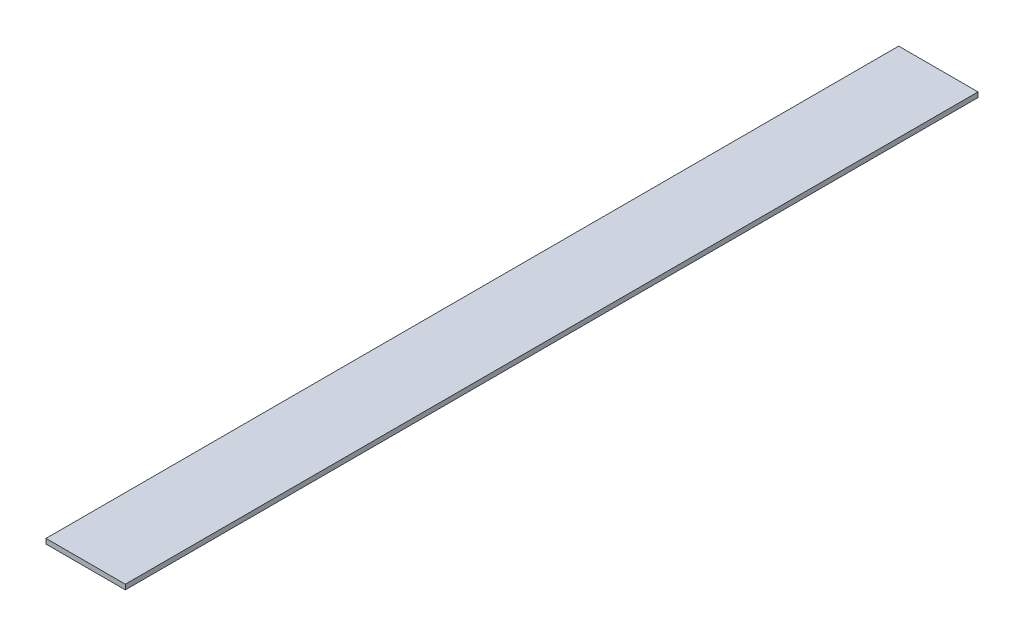
ISO-10303-21;
HEADER;
FILE_DESCRIPTION(('STEP AP214'),'2;1');
FILE_NAME('part.step','',(''),(''),'','','');
FILE_SCHEMA(('AUTOMOTIVE_DESIGN { 1 0 10303 214 1 1 1 1 }'));
ENDSEC;
DATA;
#1=APPLICATION_CONTEXT('core data for automotive mechanical design processes');
#2=APPLICATION_PROTOCOL_DEFINITION('international standard','automotive_design',2000,#1);
#3=PRODUCT_CONTEXT('',#1,'mechanical');
#4=PRODUCT('Part','Part','',(#3));
#5=PRODUCT_RELATED_PRODUCT_CATEGORY('part','',(#4));
#6=PRODUCT_DEFINITION_FORMATION('','',#4);
#7=PRODUCT_DEFINITION_CONTEXT('part definition',#1,'design');
#8=PRODUCT_DEFINITION('design','',#6,#7);
#9=PRODUCT_DEFINITION_SHAPE('','',#8);
#10=(LENGTH_UNIT() NAMED_UNIT(*) SI_UNIT(.MILLI.,.METRE.));
#11=(NAMED_UNIT(*) PLANE_ANGLE_UNIT() SI_UNIT($,.RADIAN.));
#12=(NAMED_UNIT(*) SI_UNIT($,.STERADIAN.) SOLID_ANGLE_UNIT());
#13=UNCERTAINTY_MEASURE_WITH_UNIT(LENGTH_MEASURE(1.E-05),#10,'distance_accuracy_value','');
#14=(GEOMETRIC_REPRESENTATION_CONTEXT(3) GLOBAL_UNCERTAINTY_ASSIGNED_CONTEXT((#13)) GLOBAL_UNIT_ASSIGNED_CONTEXT((#10,
#11,#12)) REPRESENTATION_CONTEXT('',''));
#15=CARTESIAN_POINT('',(0.,0.,0.));
#16=DIRECTION('',(0.,0.,1.));
#17=DIRECTION('',(1.,0.,0.));
#18=AXIS2_PLACEMENT_3D('',#15,#16,#17);
#19=CARTESIAN_POINT('',(0.,3.175,0.));
#20=DIRECTION('',(1.,0.,0.));
#21=DIRECTION('',(0.,0.,-1.));
#22=AXIS2_PLACEMENT_3D('',#19,#20,#21);
#23=PLANE('',#22);
#24=DIRECTION('',(0.,0.,1.));
#25=VECTOR('',#24,1.);
#26=CARTESIAN_POINT('',(0.,0.,0.));
#27=LINE('',#26,#25);
#28=CARTESIAN_POINT('',(0.,0.,-546.1));
#29=VERTEX_POINT('',#28);
#30=CARTESIAN_POINT('',(0.,0.,0.));
#31=VERTEX_POINT('',#30);
#32=EDGE_CURVE('E95',#29,#31,#27,.T.);
#33=ORIENTED_EDGE('',*,*,#32,.T.);
#34=DIRECTION('',(0.,-1.,0.));
#35=VECTOR('',#34,1.);
#36=CARTESIAN_POINT('',(0.,3.175,0.));
#37=LINE('',#36,#35);
#38=CARTESIAN_POINT('',(0.,3.175,0.));
#39=VERTEX_POINT('',#38);
#40=EDGE_CURVE('E11',#39,#31,#37,.T.);
#41=ORIENTED_EDGE('',*,*,#40,.F.);
#42=DIRECTION('',(0.,0.,1.));
#43=VECTOR('',#42,1.);
#44=CARTESIAN_POINT('',(0.,3.175,0.));
#45=LINE('',#44,#43);
#46=CARTESIAN_POINT('',(0.,3.175,-546.1));
#47=VERTEX_POINT('',#46);
#48=EDGE_CURVE('E83',#47,#39,#45,.T.);
#49=ORIENTED_EDGE('',*,*,#48,.F.);
#50=DIRECTION('',(0.,-1.,0.));
#51=VECTOR('',#50,1.);
#52=CARTESIAN_POINT('',(0.,3.175,-546.1));
#53=LINE('',#52,#51);
#54=EDGE_CURVE('E91',#47,#29,#53,.T.);
#55=ORIENTED_EDGE('',*,*,#54,.T.);
#56=EDGE_LOOP('',(#33,#41,#49,#55));
#57=FACE_BOUND('',#56,.T.);
#58=ADVANCED_FACE('F32',(#57),#23,.F.);
#59=CARTESIAN_POINT('',(0.,3.175,0.));
#60=DIRECTION('',(0.,0.,-1.));
#61=DIRECTION('',(-1.,0.,0.));
#62=AXIS2_PLACEMENT_3D('',#59,#60,#61);
#63=PLANE('',#62);
#64=DIRECTION('',(1.,0.,0.));
#65=VECTOR('',#64,1.);
#66=CARTESIAN_POINT('',(0.,0.,0.));
#67=LINE('',#66,#65);
#68=CARTESIAN_POINT('',(50.8,0.,0.));
#69=VERTEX_POINT('',#68);
#70=EDGE_CURVE('E87',#31,#69,#67,.T.);
#71=ORIENTED_EDGE('',*,*,#70,.T.);
#72=DIRECTION('',(0.,-1.,0.));
#73=VECTOR('',#72,1.);
#74=CARTESIAN_POINT('',(50.8,3.175,0.));
#75=LINE('',#74,#73);
#76=CARTESIAN_POINT('',(50.8,3.175,0.));
#77=VERTEX_POINT('',#76);
#78=EDGE_CURVE('E40',#77,#69,#75,.T.);
#79=ORIENTED_EDGE('',*,*,#78,.F.);
#80=DIRECTION('',(1.,0.,0.));
#81=VECTOR('',#80,1.);
#82=CARTESIAN_POINT('',(0.,3.175,0.));
#83=LINE('',#82,#81);
#84=EDGE_CURVE('E78',#39,#77,#83,.T.);
#85=ORIENTED_EDGE('',*,*,#84,.F.);
#86=ORIENTED_EDGE('',*,*,#40,.T.);
#87=EDGE_LOOP('',(#71,#79,#85,#86));
#88=FACE_BOUND('',#87,.T.);
#89=ADVANCED_FACE('F86',(#88),#63,.F.);
#90=CARTESIAN_POINT('',(50.8,3.175,0.));
#91=DIRECTION('',(-1.,0.,0.));
#92=DIRECTION('',(0.,0.,1.));
#93=AXIS2_PLACEMENT_3D('',#90,#91,#92);
#94=PLANE('',#93);
#95=DIRECTION('',(0.,0.,-1.));
#96=VECTOR('',#95,1.);
#97=CARTESIAN_POINT('',(50.8,0.,0.));
#98=LINE('',#97,#96);
#99=CARTESIAN_POINT('',(50.8,0.,-546.1));
#100=VERTEX_POINT('',#99);
#101=EDGE_CURVE('E65',#69,#100,#98,.T.);
#102=ORIENTED_EDGE('',*,*,#101,.T.);
#103=DIRECTION('',(0.,-1.,0.));
#104=VECTOR('',#103,1.);
#105=CARTESIAN_POINT('',(50.8,3.175,-546.1));
#106=LINE('',#105,#104);
#107=CARTESIAN_POINT('',(50.8,3.175,-546.1));
#108=VERTEX_POINT('',#107);
#109=EDGE_CURVE('E88',#108,#100,#106,.T.);
#110=ORIENTED_EDGE('',*,*,#109,.F.);
#111=DIRECTION('',(0.,0.,-1.));
#112=VECTOR('',#111,1.);
#113=CARTESIAN_POINT('',(50.8,3.175,0.));
#114=LINE('',#113,#112);
#115=EDGE_CURVE('E81',#77,#108,#114,.T.);
#116=ORIENTED_EDGE('',*,*,#115,.F.);
#117=ORIENTED_EDGE('',*,*,#78,.T.);
#118=EDGE_LOOP('',(#102,#110,#116,#117));
#119=FACE_BOUND('',#118,.T.);
#120=ADVANCED_FACE('F89',(#119),#94,.F.);
#121=CARTESIAN_POINT('',(0.,3.175,-546.1));
#122=DIRECTION('',(0.,0.,1.));
#123=DIRECTION('',(1.,0.,0.));
#124=AXIS2_PLACEMENT_3D('',#121,#122,#123);
#125=PLANE('',#124);
#126=DIRECTION('',(-1.,0.,0.));
#127=VECTOR('',#126,1.);
#128=CARTESIAN_POINT('',(0.,0.,-546.1));
#129=LINE('',#128,#127);
#130=EDGE_CURVE('E71',#100,#29,#129,.T.);
#131=ORIENTED_EDGE('',*,*,#130,.T.);
#132=ORIENTED_EDGE('',*,*,#54,.F.);
#133=DIRECTION('',(-1.,0.,0.));
#134=VECTOR('',#133,1.);
#135=CARTESIAN_POINT('',(0.,3.175,-546.1));
#136=LINE('',#135,#134);
#137=EDGE_CURVE('E48',#108,#47,#136,.T.);
#138=ORIENTED_EDGE('',*,*,#137,.F.);
#139=ORIENTED_EDGE('',*,*,#109,.T.);
#140=EDGE_LOOP('',(#131,#132,#138,#139));
#141=FACE_BOUND('',#140,.T.);
#142=ADVANCED_FACE('F102',(#141),#125,.F.);
#143=CARTESIAN_POINT('',(0.,3.175,0.));
#144=DIRECTION('',(0.,-1.,0.));
#145=DIRECTION('',(0.,0.,-1.));
#146=AXIS2_PLACEMENT_3D('',#143,#144,#145);
#147=PLANE('',#146);
#148=ORIENTED_EDGE('',*,*,#48,.T.);
#149=ORIENTED_EDGE('',*,*,#84,.T.);
#150=ORIENTED_EDGE('',*,*,#115,.T.);
#151=ORIENTED_EDGE('',*,*,#137,.T.);
#152=EDGE_LOOP('',(#148,#149,#150,#151));
#153=FACE_BOUND('',#152,.T.);
#154=ADVANCED_FACE('F79',(#153),#147,.F.);
#155=CARTESIAN_POINT('',(0.,0.,0.));
#156=DIRECTION('',(0.,-1.,0.));
#157=DIRECTION('',(0.,0.,-1.));
#158=AXIS2_PLACEMENT_3D('',#155,#156,#157);
#159=PLANE('',#158);
#160=ORIENTED_EDGE('',*,*,#32,.F.);
#161=ORIENTED_EDGE('',*,*,#130,.F.);
#162=ORIENTED_EDGE('',*,*,#101,.F.);
#163=ORIENTED_EDGE('',*,*,#70,.F.);
#164=EDGE_LOOP('',(#160,#161,#162,#163));
#165=FACE_BOUND('',#164,.T.);
#166=ADVANCED_FACE('F105',(#165),#159,.T.);
#167=CLOSED_SHELL('',(#58,#89,#120,#142,#154,#166));
#168=MANIFOLD_SOLID_BREP('B2',#167);
#169=ADVANCED_BREP_SHAPE_REPRESENTATION('',(#18,#168),#14);
#170=SHAPE_DEFINITION_REPRESENTATION(#9,#169);
ENDSEC;
END-ISO-10303-21;
